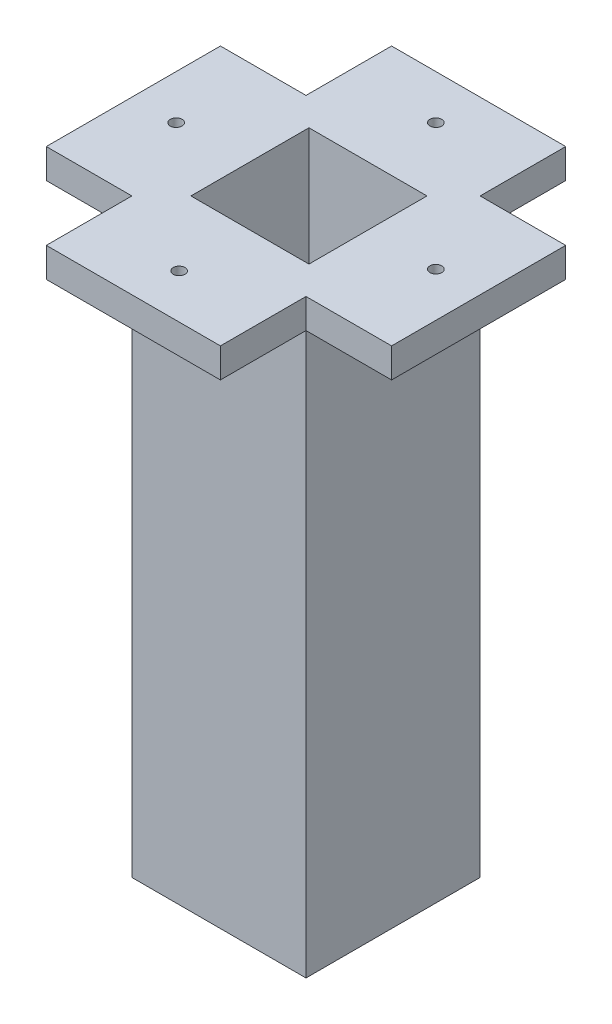
ISO-10303-21;
HEADER;
FILE_DESCRIPTION(('STEP AP214'),'2;1');
FILE_NAME('part.step','',(''),(''),'','','');
FILE_SCHEMA(('AUTOMOTIVE_DESIGN { 1 0 10303 214 1 1 1 1 }'));
ENDSEC;
DATA;
#1=APPLICATION_CONTEXT('core data for automotive mechanical design processes');
#2=APPLICATION_PROTOCOL_DEFINITION('international standard','automotive_design',2000,#1);
#3=PRODUCT_CONTEXT('',#1,'mechanical');
#4=PRODUCT('Part','Part','',(#3));
#5=PRODUCT_RELATED_PRODUCT_CATEGORY('part','',(#4));
#6=PRODUCT_DEFINITION_FORMATION('','',#4);
#7=PRODUCT_DEFINITION_CONTEXT('part definition',#1,'design');
#8=PRODUCT_DEFINITION('design','',#6,#7);
#9=PRODUCT_DEFINITION_SHAPE('','',#8);
#10=(LENGTH_UNIT() NAMED_UNIT(*) SI_UNIT(.MILLI.,.METRE.));
#11=(NAMED_UNIT(*) PLANE_ANGLE_UNIT() SI_UNIT($,.RADIAN.));
#12=(NAMED_UNIT(*) SI_UNIT($,.STERADIAN.) SOLID_ANGLE_UNIT());
#13=UNCERTAINTY_MEASURE_WITH_UNIT(LENGTH_MEASURE(1.E-05),#10,'distance_accuracy_value','');
#14=(GEOMETRIC_REPRESENTATION_CONTEXT(3) GLOBAL_UNCERTAINTY_ASSIGNED_CONTEXT((#13)) GLOBAL_UNIT_ASSIGNED_CONTEXT((#10,
#11,#12)) REPRESENTATION_CONTEXT('',''));
#15=CARTESIAN_POINT('',(0.,0.,0.));
#16=DIRECTION('',(0.,0.,1.));
#17=DIRECTION('',(1.,0.,0.));
#18=AXIS2_PLACEMENT_3D('',#15,#16,#17);
#19=CARTESIAN_POINT('',(0.,200.,-59.));
#20=DIRECTION('',(0.,0.,-1.));
#21=DIRECTION('',(-1.,0.,0.));
#22=AXIS2_PLACEMENT_3D('',#19,#20,#21);
#23=PLANE('',#22);
#24=DIRECTION('',(0.,1.,0.));
#25=VECTOR('',#24,1.);
#26=CARTESIAN_POINT('',(0.,190.,-59.));
#27=LINE('',#26,#25);
#28=CARTESIAN_POINT('',(0.,190.,-59.));
#29=VERTEX_POINT('',#28);
#30=CARTESIAN_POINT('',(0.,200.,-59.));
#31=VERTEX_POINT('',#30);
#32=EDGE_CURVE('E199',#29,#31,#27,.T.);
#33=ORIENTED_EDGE('',*,*,#32,.F.);
#34=DIRECTION('',(-1.,0.,0.));
#35=VECTOR('',#34,1.);
#36=CARTESIAN_POINT('',(0.,190.,-59.));
#37=LINE('',#36,#35);
#38=CARTESIAN_POINT('',(-29.,190.,-59.));
#39=VERTEX_POINT('',#38);
#40=EDGE_CURVE('E211',#29,#39,#37,.T.);
#41=ORIENTED_EDGE('',*,*,#40,.T.);
#42=DIRECTION('',(0.,1.,0.));
#43=VECTOR('',#42,1.);
#44=CARTESIAN_POINT('',(-29.,190.,-59.));
#45=LINE('',#44,#43);
#46=CARTESIAN_POINT('',(-29.,200.,-59.));
#47=VERTEX_POINT('',#46);
#48=EDGE_CURVE('E241',#39,#47,#45,.T.);
#49=ORIENTED_EDGE('',*,*,#48,.T.);
#50=DIRECTION('',(1.,0.,0.));
#51=VECTOR('',#50,1.);
#52=CARTESIAN_POINT('',(0.,200.,-59.));
#53=LINE('',#52,#51);
#54=EDGE_CURVE('E212',#47,#31,#53,.T.);
#55=ORIENTED_EDGE('',*,*,#54,.T.);
#56=EDGE_LOOP('',(#33,#41,#49,#55));
#57=FACE_BOUND('',#56,.T.);
#58=ADVANCED_FACE('F33',(#57),#23,.T.);
#59=DIRECTION('',(1.,0.,0.));
#60=VECTOR('',#59,1.);
#61=CARTESIAN_POINT('',(0.,190.,-59.));
#62=LINE('',#61,#60);
#63=CARTESIAN_POINT('',(59.,190.,-59.));
#64=VERTEX_POINT('',#63);
#65=CARTESIAN_POINT('',(88.,190.,-59.));
#66=VERTEX_POINT('',#65);
#67=EDGE_CURVE('E279',#64,#66,#62,.T.);
#68=ORIENTED_EDGE('',*,*,#67,.F.);
#69=DIRECTION('',(0.,1.,0.));
#70=VECTOR('',#69,1.);
#71=CARTESIAN_POINT('',(59.,190.,-59.));
#72=LINE('',#71,#70);
#73=CARTESIAN_POINT('',(59.,200.,-59.));
#74=VERTEX_POINT('',#73);
#75=EDGE_CURVE('E203',#64,#74,#72,.T.);
#76=ORIENTED_EDGE('',*,*,#75,.T.);
#77=CARTESIAN_POINT('',(88.,200.,-59.));
#78=VERTEX_POINT('',#77);
#79=EDGE_CURVE('E372',#74,#78,#53,.T.);
#80=ORIENTED_EDGE('',*,*,#79,.T.);
#81=DIRECTION('',(0.,1.,0.));
#82=VECTOR('',#81,1.);
#83=CARTESIAN_POINT('',(88.,190.,-59.));
#84=LINE('',#83,#82);
#85=EDGE_CURVE('E287',#66,#78,#84,.T.);
#86=ORIENTED_EDGE('',*,*,#85,.F.);
#87=EDGE_LOOP('',(#68,#76,#80,#86));
#88=FACE_BOUND('',#87,.T.);
#89=ADVANCED_FACE('F430',(#88),#23,.T.);
#90=CARTESIAN_POINT('',(0.,200.,0.));
#91=DIRECTION('',(-1.,0.,0.));
#92=DIRECTION('',(0.,0.,1.));
#93=AXIS2_PLACEMENT_3D('',#90,#91,#92);
#94=PLANE('',#93);
#95=DIRECTION('',(0.,1.,0.));
#96=VECTOR('',#95,1.);
#97=CARTESIAN_POINT('',(0.,190.,0.));
#98=LINE('',#97,#96);
#99=CARTESIAN_POINT('',(0.,190.,0.));
#100=VERTEX_POINT('',#99);
#101=CARTESIAN_POINT('',(0.,200.,0.));
#102=VERTEX_POINT('',#101);
#103=EDGE_CURVE('E577',#100,#102,#98,.T.);
#104=ORIENTED_EDGE('',*,*,#103,.F.);
#105=DIRECTION('',(0.,0.,1.));
#106=VECTOR('',#105,1.);
#107=CARTESIAN_POINT('',(0.,190.,0.));
#108=LINE('',#107,#106);
#109=CARTESIAN_POINT('',(0.,190.,29.));
#110=VERTEX_POINT('',#109);
#111=EDGE_CURVE('E259',#100,#110,#108,.T.);
#112=ORIENTED_EDGE('',*,*,#111,.T.);
#113=DIRECTION('',(0.,1.,0.));
#114=VECTOR('',#113,1.);
#115=CARTESIAN_POINT('',(0.,190.,29.));
#116=LINE('',#115,#114);
#117=CARTESIAN_POINT('',(0.,200.,29.));
#118=VERTEX_POINT('',#117);
#119=EDGE_CURVE('E256',#110,#118,#116,.T.);
#120=ORIENTED_EDGE('',*,*,#119,.T.);
#121=DIRECTION('',(0.,0.,-1.));
#122=VECTOR('',#121,1.);
#123=CARTESIAN_POINT('',(0.,200.,0.));
#124=LINE('',#123,#122);
#125=EDGE_CURVE('E56',#118,#102,#124,.T.);
#126=ORIENTED_EDGE('',*,*,#125,.T.);
#127=EDGE_LOOP('',(#104,#112,#120,#126));
#128=FACE_BOUND('',#127,.T.);
#129=ADVANCED_FACE('F434',(#128),#94,.T.);
#130=CARTESIAN_POINT('',(0.,200.,0.));
#131=DIRECTION('',(0.,0.,-1.));
#132=DIRECTION('',(-1.,0.,0.));
#133=AXIS2_PLACEMENT_3D('',#130,#131,#132);
#134=PLANE('',#133);
#135=DIRECTION('',(0.,1.,0.));
#136=VECTOR('',#135,1.);
#137=CARTESIAN_POINT('',(59.,190.,0.));
#138=LINE('',#137,#136);
#139=CARTESIAN_POINT('',(59.,190.,0.));
#140=VERTEX_POINT('',#139);
#141=CARTESIAN_POINT('',(59.,200.,0.));
#142=VERTEX_POINT('',#141);
#143=EDGE_CURVE('E251',#140,#142,#138,.T.);
#144=ORIENTED_EDGE('',*,*,#143,.F.);
#145=DIRECTION('',(1.,0.,0.));
#146=VECTOR('',#145,1.);
#147=CARTESIAN_POINT('',(0.,190.,0.));
#148=LINE('',#147,#146);
#149=CARTESIAN_POINT('',(88.,190.,0.));
#150=VERTEX_POINT('',#149);
#151=EDGE_CURVE('E284',#140,#150,#148,.T.);
#152=ORIENTED_EDGE('',*,*,#151,.T.);
#153=DIRECTION('',(0.,1.,0.));
#154=VECTOR('',#153,1.);
#155=CARTESIAN_POINT('',(88.,190.,0.));
#156=LINE('',#155,#154);
#157=CARTESIAN_POINT('',(88.,200.,0.));
#158=VERTEX_POINT('',#157);
#159=EDGE_CURVE('E290',#150,#158,#156,.T.);
#160=ORIENTED_EDGE('',*,*,#159,.T.);
#161=DIRECTION('',(1.,0.,0.));
#162=VECTOR('',#161,1.);
#163=CARTESIAN_POINT('',(0.,200.,0.));
#164=LINE('',#163,#162);
#165=EDGE_CURVE('E371',#142,#158,#164,.T.);
#166=ORIENTED_EDGE('',*,*,#165,.F.);
#167=EDGE_LOOP('',(#144,#152,#160,#166));
#168=FACE_BOUND('',#167,.T.);
#169=ADVANCED_FACE('F599',(#168),#134,.F.);
#170=DIRECTION('',(1.,0.,0.));
#171=VECTOR('',#170,1.);
#172=CARTESIAN_POINT('',(0.,190.,0.));
#173=LINE('',#172,#171);
#174=EDGE_CURVE('E266',#100,#140,#173,.T.);
#175=ORIENTED_EDGE('',*,*,#174,.F.);
#176=DIRECTION('',(0.,-1.,0.));
#177=VECTOR('',#176,1.);
#178=CARTESIAN_POINT('',(0.,200.,0.));
#179=LINE('',#178,#177);
#180=CARTESIAN_POINT('',(0.,0.,0.));
#181=VERTEX_POINT('',#180);
#182=EDGE_CURVE('E225',#100,#181,#179,.T.);
#183=ORIENTED_EDGE('',*,*,#182,.T.);
#184=DIRECTION('',(1.,0.,0.));
#185=VECTOR('',#184,1.);
#186=CARTESIAN_POINT('',(0.,0.,0.));
#187=LINE('',#186,#185);
#188=CARTESIAN_POINT('',(59.,0.,0.));
#189=VERTEX_POINT('',#188);
#190=EDGE_CURVE('E380',#181,#189,#187,.T.);
#191=ORIENTED_EDGE('',*,*,#190,.T.);
#192=DIRECTION('',(0.,-1.,0.));
#193=VECTOR('',#192,1.);
#194=CARTESIAN_POINT('',(59.,200.,0.));
#195=LINE('',#194,#193);
#196=EDGE_CURVE('E386',#140,#189,#195,.T.);
#197=ORIENTED_EDGE('',*,*,#196,.F.);
#198=EDGE_LOOP('',(#175,#183,#191,#197));
#199=FACE_BOUND('',#198,.T.);
#200=ADVANCED_FACE('F610',(#199),#134,.F.);
#201=CARTESIAN_POINT('',(59.,200.,0.));
#202=DIRECTION('',(-1.,0.,0.));
#203=DIRECTION('',(0.,0.,1.));
#204=AXIS2_PLACEMENT_3D('',#201,#202,#203);
#205=PLANE('',#204);
#206=DIRECTION('',(0.,0.,-1.));
#207=VECTOR('',#206,1.);
#208=CARTESIAN_POINT('',(59.,190.,0.));
#209=LINE('',#208,#207);
#210=EDGE_CURVE('E281',#140,#64,#209,.T.);
#211=ORIENTED_EDGE('',*,*,#210,.F.);
#212=ORIENTED_EDGE('',*,*,#196,.T.);
#213=DIRECTION('',(0.,0.,-1.));
#214=VECTOR('',#213,1.);
#215=CARTESIAN_POINT('',(59.,0.,0.));
#216=LINE('',#215,#214);
#217=CARTESIAN_POINT('',(59.,0.,-59.));
#218=VERTEX_POINT('',#217);
#219=EDGE_CURVE('E377',#189,#218,#216,.T.);
#220=ORIENTED_EDGE('',*,*,#219,.T.);
#221=DIRECTION('',(0.,-1.,0.));
#222=VECTOR('',#221,1.);
#223=CARTESIAN_POINT('',(59.,200.,-59.));
#224=LINE('',#223,#222);
#225=EDGE_CURVE('E375',#64,#218,#224,.T.);
#226=ORIENTED_EDGE('',*,*,#225,.F.);
#227=EDGE_LOOP('',(#211,#212,#220,#226));
#228=FACE_BOUND('',#227,.T.);
#229=ADVANCED_FACE('F449',(#228),#205,.F.);
#230=DIRECTION('',(0.,0.,1.));
#231=VECTOR('',#230,1.);
#232=CARTESIAN_POINT('',(0.,190.,0.));
#233=LINE('',#232,#231);
#234=EDGE_CURVE('E219',#29,#100,#233,.T.);
#235=ORIENTED_EDGE('',*,*,#234,.F.);
#236=DIRECTION('',(0.,-1.,0.));
#237=VECTOR('',#236,1.);
#238=CARTESIAN_POINT('',(0.,200.,-59.));
#239=LINE('',#238,#237);
#240=CARTESIAN_POINT('',(0.,0.,-59.));
#241=VERTEX_POINT('',#240);
#242=EDGE_CURVE('E223',#29,#241,#239,.T.);
#243=ORIENTED_EDGE('',*,*,#242,.T.);
#244=DIRECTION('',(0.,0.,-1.));
#245=VECTOR('',#244,1.);
#246=CARTESIAN_POINT('',(0.,0.,0.));
#247=LINE('',#246,#245);
#248=EDGE_CURVE('E383',#181,#241,#247,.T.);
#249=ORIENTED_EDGE('',*,*,#248,.F.);
#250=ORIENTED_EDGE('',*,*,#182,.F.);
#251=EDGE_LOOP('',(#235,#243,#249,#250));
#252=FACE_BOUND('',#251,.T.);
#253=CARTESIAN_POINT('',(0.,123.5,-25.5));
#254=DIRECTION('',(-1.,0.,0.));
#255=DIRECTION('',(0.,0.,1.));
#256=AXIS2_PLACEMENT_3D('',#253,#254,#255);
#257=CIRCLE('',#256,2.00000000000001);
#258=CARTESIAN_POINT('',(0.,123.5,-23.5));
#259=VERTEX_POINT('',#258);
#260=EDGE_CURVE('E306',#259,#259,#257,.T.);
#261=ORIENTED_EDGE('',*,*,#260,.F.);
#262=EDGE_LOOP('',(#261));
#263=FACE_BOUND('',#262,.T.);
#264=CARTESIAN_POINT('',(0.,75.5,-33.5));
#265=DIRECTION('',(-1.,0.,0.));
#266=DIRECTION('',(0.,0.,1.));
#267=AXIS2_PLACEMENT_3D('',#264,#265,#266);
#268=CIRCLE('',#267,2.);
#269=CARTESIAN_POINT('',(0.,75.5,-31.5));
#270=VERTEX_POINT('',#269);
#271=EDGE_CURVE('E299',#270,#270,#268,.T.);
#272=ORIENTED_EDGE('',*,*,#271,.F.);
#273=EDGE_LOOP('',(#272));
#274=FACE_BOUND('',#273,.T.);
#275=CARTESIAN_POINT('',(0.,75.5,-25.5));
#276=DIRECTION('',(-1.,0.,0.));
#277=DIRECTION('',(0.,0.,1.));
#278=AXIS2_PLACEMENT_3D('',#275,#276,#277);
#279=CIRCLE('',#278,1.99999999999999);
#280=CARTESIAN_POINT('',(0.,75.5,-23.5));
#281=VERTEX_POINT('',#280);
#282=EDGE_CURVE('E293',#281,#281,#279,.T.);
#283=ORIENTED_EDGE('',*,*,#282,.F.);
#284=EDGE_LOOP('',(#283));
#285=FACE_BOUND('',#284,.T.);
#286=CARTESIAN_POINT('',(0.,123.5,-33.5));
#287=DIRECTION('',(-1.,0.,0.));
#288=DIRECTION('',(0.,0.,1.));
#289=AXIS2_PLACEMENT_3D('',#286,#287,#288);
#290=CIRCLE('',#289,2.);
#291=CARTESIAN_POINT('',(0.,123.5,-31.5));
#292=VERTEX_POINT('',#291);
#293=EDGE_CURVE('E305',#292,#292,#290,.T.);
#294=ORIENTED_EDGE('',*,*,#293,.F.);
#295=EDGE_LOOP('',(#294));
#296=FACE_BOUND('',#295,.T.);
#297=DIRECTION('',(0.,0.,-1.));
#298=VECTOR('',#297,1.);
#299=CARTESIAN_POINT('',(0.,79.,-39.));
#300=LINE('',#299,#298);
#301=CARTESIAN_POINT('',(0.,79.,-20.));
#302=VERTEX_POINT('',#301);
#303=CARTESIAN_POINT('',(0.,79.,-39.));
#304=VERTEX_POINT('',#303);
#305=EDGE_CURVE('E323',#302,#304,#300,.T.);
#306=ORIENTED_EDGE('',*,*,#305,.T.);
#307=DIRECTION('',(0.,1.,0.));
#308=VECTOR('',#307,1.);
#309=CARTESIAN_POINT('',(0.,120.,-39.));
#310=LINE('',#309,#308);
#311=CARTESIAN_POINT('',(0.,120.,-39.));
#312=VERTEX_POINT('',#311);
#313=EDGE_CURVE('E317',#304,#312,#310,.T.);
#314=ORIENTED_EDGE('',*,*,#313,.T.);
#315=DIRECTION('',(0.,0.,1.));
#316=VECTOR('',#315,1.);
#317=CARTESIAN_POINT('',(0.,120.,-39.));
#318=LINE('',#317,#316);
#319=CARTESIAN_POINT('',(0.,120.,-20.));
#320=VERTEX_POINT('',#319);
#321=EDGE_CURVE('E333',#312,#320,#318,.T.);
#322=ORIENTED_EDGE('',*,*,#321,.T.);
#323=DIRECTION('',(0.,-1.,0.));
#324=VECTOR('',#323,1.);
#325=CARTESIAN_POINT('',(0.,120.,-20.));
#326=LINE('',#325,#324);
#327=EDGE_CURVE('E336',#320,#302,#326,.T.);
#328=ORIENTED_EDGE('',*,*,#327,.T.);
#329=EDGE_LOOP('',(#306,#314,#322,#328));
#330=FACE_BOUND('',#329,.T.);
#331=ADVANCED_FACE('F220',(#252,#263,#274,#285,#296,#330),#94,.T.);
#332=CARTESIAN_POINT('',(9.99999999999999,-50.,-50.));
#333=DIRECTION('',(-1.,0.,0.));
#334=DIRECTION('',(0.,0.,1.));
#335=AXIS2_PLACEMENT_3D('',#332,#333,#334);
#336=PLANE('',#335);
#337=CARTESIAN_POINT('',(10.,123.5,-25.5));
#338=DIRECTION('',(-1.,0.,0.));
#339=DIRECTION('',(0.,0.,1.));
#340=AXIS2_PLACEMENT_3D('',#337,#338,#339);
#341=CIRCLE('',#340,2.00000000000001);
#342=CARTESIAN_POINT('',(10.,123.5,-23.5));
#343=VERTEX_POINT('',#342);
#344=EDGE_CURVE('E302',#343,#343,#341,.T.);
#345=ORIENTED_EDGE('',*,*,#344,.T.);
#346=EDGE_LOOP('',(#345));
#347=FACE_BOUND('',#346,.T.);
#348=CARTESIAN_POINT('',(10.,75.5,-33.5));
#349=DIRECTION('',(-1.,0.,0.));
#350=DIRECTION('',(0.,0.,1.));
#351=AXIS2_PLACEMENT_3D('',#348,#349,#350);
#352=CIRCLE('',#351,2.);
#353=CARTESIAN_POINT('',(10.,75.5,-31.5));
#354=VERTEX_POINT('',#353);
#355=EDGE_CURVE('E309',#354,#354,#352,.T.);
#356=ORIENTED_EDGE('',*,*,#355,.T.);
#357=EDGE_LOOP('',(#356));
#358=FACE_BOUND('',#357,.T.);
#359=CARTESIAN_POINT('',(10.,75.5,-25.5));
#360=DIRECTION('',(-1.,0.,0.));
#361=DIRECTION('',(0.,0.,1.));
#362=AXIS2_PLACEMENT_3D('',#359,#360,#361);
#363=CIRCLE('',#362,1.99999999999999);
#364=CARTESIAN_POINT('',(10.,75.5,-23.5));
#365=VERTEX_POINT('',#364);
#366=EDGE_CURVE('E296',#365,#365,#363,.T.);
#367=ORIENTED_EDGE('',*,*,#366,.T.);
#368=EDGE_LOOP('',(#367));
#369=FACE_BOUND('',#368,.T.);
#370=CARTESIAN_POINT('',(10.,123.5,-33.5));
#371=DIRECTION('',(-1.,0.,0.));
#372=DIRECTION('',(0.,0.,1.));
#373=AXIS2_PLACEMENT_3D('',#370,#371,#372);
#374=CIRCLE('',#373,2.);
#375=CARTESIAN_POINT('',(10.,123.5,-31.5));
#376=VERTEX_POINT('',#375);
#377=EDGE_CURVE('E314',#376,#376,#374,.T.);
#378=ORIENTED_EDGE('',*,*,#377,.T.);
#379=EDGE_LOOP('',(#378));
#380=FACE_BOUND('',#379,.T.);
#381=DIRECTION('',(0.,1.,0.));
#382=VECTOR('',#381,1.);
#383=CARTESIAN_POINT('',(9.99999999999999,-50.,-50.));
#384=LINE('',#383,#382);
#385=CARTESIAN_POINT('',(9.99999999999999,0.,-50.));
#386=VERTEX_POINT('',#385);
#387=CARTESIAN_POINT('',(9.99999999999999,200.,-50.));
#388=VERTEX_POINT('',#387);
#389=EDGE_CURVE('E364',#386,#388,#384,.T.);
#390=ORIENTED_EDGE('',*,*,#389,.T.);
#391=DIRECTION('',(0.,0.,1.));
#392=VECTOR('',#391,1.);
#393=CARTESIAN_POINT('',(9.99999999999999,200.,-50.));
#394=LINE('',#393,#392);
#395=CARTESIAN_POINT('',(10.,200.,-10.));
#396=VERTEX_POINT('',#395);
#397=EDGE_CURVE('E358',#388,#396,#394,.T.);
#398=ORIENTED_EDGE('',*,*,#397,.T.);
#399=DIRECTION('',(0.,1.,0.));
#400=VECTOR('',#399,1.);
#401=CARTESIAN_POINT('',(10.,-50.,-10.));
#402=LINE('',#401,#400);
#403=CARTESIAN_POINT('',(10.,0.,-10.));
#404=VERTEX_POINT('',#403);
#405=EDGE_CURVE('E362',#404,#396,#402,.T.);
#406=ORIENTED_EDGE('',*,*,#405,.F.);
#407=DIRECTION('',(0.,0.,1.));
#408=VECTOR('',#407,1.);
#409=CARTESIAN_POINT('',(10.,0.,0.));
#410=LINE('',#409,#408);
#411=EDGE_CURVE('E41',#386,#404,#410,.T.);
#412=ORIENTED_EDGE('',*,*,#411,.F.);
#413=EDGE_LOOP('',(#390,#398,#406,#412));
#414=FACE_BOUND('',#413,.T.);
#415=DIRECTION('',(0.,1.,0.));
#416=VECTOR('',#415,1.);
#417=CARTESIAN_POINT('',(10.,120.,-39.));
#418=LINE('',#417,#416);
#419=CARTESIAN_POINT('',(10.,79.,-39.));
#420=VERTEX_POINT('',#419);
#421=CARTESIAN_POINT('',(10.,120.,-39.));
#422=VERTEX_POINT('',#421);
#423=EDGE_CURVE('E320',#420,#422,#418,.T.);
#424=ORIENTED_EDGE('',*,*,#423,.F.);
#425=DIRECTION('',(0.,0.,-1.));
#426=VECTOR('',#425,1.);
#427=CARTESIAN_POINT('',(10.,79.,-39.));
#428=LINE('',#427,#426);
#429=CARTESIAN_POINT('',(10.,79.,-20.));
#430=VERTEX_POINT('',#429);
#431=EDGE_CURVE('E328',#430,#420,#428,.T.);
#432=ORIENTED_EDGE('',*,*,#431,.F.);
#433=DIRECTION('',(0.,-1.,0.));
#434=VECTOR('',#433,1.);
#435=CARTESIAN_POINT('',(10.,120.,-20.));
#436=LINE('',#435,#434);
#437=CARTESIAN_POINT('',(10.,120.,-20.));
#438=VERTEX_POINT('',#437);
#439=EDGE_CURVE('E325',#438,#430,#436,.T.);
#440=ORIENTED_EDGE('',*,*,#439,.F.);
#441=DIRECTION('',(0.,0.,1.));
#442=VECTOR('',#441,1.);
#443=CARTESIAN_POINT('',(10.,120.,-39.));
#444=LINE('',#443,#442);
#445=EDGE_CURVE('E322',#422,#438,#444,.T.);
#446=ORIENTED_EDGE('',*,*,#445,.F.);
#447=EDGE_LOOP('',(#424,#432,#440,#446));
#448=FACE_BOUND('',#447,.T.);
#449=ADVANCED_FACE('F401',(#347,#358,#369,#380,#414,#448),#336,.F.);
#450=DIRECTION('',(-1.,0.,0.));
#451=VECTOR('',#450,1.);
#452=CARTESIAN_POINT('',(0.,190.,-59.));
#453=LINE('',#452,#451);
#454=EDGE_CURVE('E183',#64,#29,#453,.T.);
#455=ORIENTED_EDGE('',*,*,#454,.F.);
#456=ORIENTED_EDGE('',*,*,#225,.T.);
#457=DIRECTION('',(1.,0.,0.));
#458=VECTOR('',#457,1.);
#459=CARTESIAN_POINT('',(0.,0.,-59.));
#460=LINE('',#459,#458);
#461=EDGE_CURVE('E233',#241,#218,#460,.T.);
#462=ORIENTED_EDGE('',*,*,#461,.F.);
#463=ORIENTED_EDGE('',*,*,#242,.F.);
#464=EDGE_LOOP('',(#455,#456,#462,#463));
#465=FACE_BOUND('',#464,.T.);
#466=ADVANCED_FACE('F35',(#465),#23,.T.);
#467=CARTESIAN_POINT('',(0.,200.,0.));
#468=DIRECTION('',(0.,1.,0.));
#469=DIRECTION('',(0.,0.,1.));
#470=AXIS2_PLACEMENT_3D('',#467,#468,#469);
#471=PLANE('',#470);
#472=CARTESIAN_POINT('',(73.,200.,-30.));
#473=DIRECTION('',(0.,-1.,0.));
#474=DIRECTION('',(0.,0.,-1.));
#475=AXIS2_PLACEMENT_3D('',#472,#473,#474);
#476=CIRCLE('',#475,2.);
#477=CARTESIAN_POINT('',(73.,200.,-32.));
#478=VERTEX_POINT('',#477);
#479=EDGE_CURVE('E543',#478,#478,#476,.T.);
#480=ORIENTED_EDGE('',*,*,#479,.T.);
#481=EDGE_LOOP('',(#480));
#482=FACE_BOUND('',#481,.T.);
#483=CARTESIAN_POINT('',(30.,200.,14.));
#484=DIRECTION('',(0.,-1.,0.));
#485=DIRECTION('',(0.,0.,-1.));
#486=AXIS2_PLACEMENT_3D('',#483,#484,#485);
#487=CIRCLE('',#486,2.);
#488=CARTESIAN_POINT('',(30.,200.,12.));
#489=VERTEX_POINT('',#488);
#490=EDGE_CURVE('E547',#489,#489,#487,.T.);
#491=ORIENTED_EDGE('',*,*,#490,.T.);
#492=EDGE_LOOP('',(#491));
#493=FACE_BOUND('',#492,.T.);
#494=CARTESIAN_POINT('',(-14.,200.,-29.));
#495=DIRECTION('',(0.,-1.,0.));
#496=DIRECTION('',(0.,0.,-1.));
#497=AXIS2_PLACEMENT_3D('',#494,#495,#496);
#498=CIRCLE('',#497,2.);
#499=CARTESIAN_POINT('',(-14.,200.,-31.));
#500=VERTEX_POINT('',#499);
#501=EDGE_CURVE('E556',#500,#500,#498,.T.);
#502=ORIENTED_EDGE('',*,*,#501,.T.);
#503=EDGE_LOOP('',(#502));
#504=FACE_BOUND('',#503,.T.);
#505=CARTESIAN_POINT('',(30.,200.,-73.));
#506=DIRECTION('',(0.,-1.,0.));
#507=DIRECTION('',(0.,0.,-1.));
#508=AXIS2_PLACEMENT_3D('',#505,#506,#507);
#509=CIRCLE('',#508,2.);
#510=CARTESIAN_POINT('',(30.,200.,-75.));
#511=VERTEX_POINT('',#510);
#512=EDGE_CURVE('E562',#511,#511,#509,.T.);
#513=ORIENTED_EDGE('',*,*,#512,.T.);
#514=EDGE_LOOP('',(#513));
#515=FACE_BOUND('',#514,.T.);
#516=DIRECTION('',(1.,0.,0.));
#517=VECTOR('',#516,1.);
#518=CARTESIAN_POINT('',(10.,200.,-10.));
#519=LINE('',#518,#517);
#520=CARTESIAN_POINT('',(50.,200.,-10.));
#521=VERTEX_POINT('',#520);
#522=EDGE_CURVE('E350',#396,#521,#519,.T.);
#523=ORIENTED_EDGE('',*,*,#522,.F.);
#524=ORIENTED_EDGE('',*,*,#397,.F.);
#525=DIRECTION('',(1.,0.,0.));
#526=VECTOR('',#525,1.);
#527=CARTESIAN_POINT('',(9.99999999999999,200.,-50.));
#528=LINE('',#527,#526);
#529=CARTESIAN_POINT('',(50.,200.,-50.));
#530=VERTEX_POINT('',#529);
#531=EDGE_CURVE('E355',#388,#530,#528,.T.);
#532=ORIENTED_EDGE('',*,*,#531,.T.);
#533=DIRECTION('',(0.,0.,1.));
#534=VECTOR('',#533,1.);
#535=CARTESIAN_POINT('',(50.,200.,-50.));
#536=LINE('',#535,#534);
#537=EDGE_CURVE('E352',#530,#521,#536,.T.);
#538=ORIENTED_EDGE('',*,*,#537,.T.);
#539=EDGE_LOOP('',(#523,#524,#532,#538));
#540=FACE_BOUND('',#539,.T.);
#541=ORIENTED_EDGE('',*,*,#54,.F.);
#542=DIRECTION('',(0.,0.,1.));
#543=VECTOR('',#542,1.);
#544=CARTESIAN_POINT('',(-29.,200.,0.));
#545=LINE('',#544,#543);
#546=CARTESIAN_POINT('',(-29.,200.,0.));
#547=VERTEX_POINT('',#546);
#548=EDGE_CURVE('E269',#47,#547,#545,.T.);
#549=ORIENTED_EDGE('',*,*,#548,.T.);
#550=DIRECTION('',(-1.,0.,0.));
#551=VECTOR('',#550,1.);
#552=CARTESIAN_POINT('',(0.,200.,0.));
#553=LINE('',#552,#551);
#554=EDGE_CURVE('E244',#102,#547,#553,.T.);
#555=ORIENTED_EDGE('',*,*,#554,.F.);
#556=ORIENTED_EDGE('',*,*,#125,.F.);
#557=DIRECTION('',(1.,0.,0.));
#558=VECTOR('',#557,1.);
#559=CARTESIAN_POINT('',(0.,200.,29.));
#560=LINE('',#559,#558);
#561=CARTESIAN_POINT('',(59.,200.,29.));
#562=VERTEX_POINT('',#561);
#563=EDGE_CURVE('E262',#118,#562,#560,.T.);
#564=ORIENTED_EDGE('',*,*,#563,.T.);
#565=DIRECTION('',(0.,0.,1.));
#566=VECTOR('',#565,1.);
#567=CARTESIAN_POINT('',(59.,200.,0.));
#568=LINE('',#567,#566);
#569=EDGE_CURVE('E255',#142,#562,#568,.T.);
#570=ORIENTED_EDGE('',*,*,#569,.F.);
#571=ORIENTED_EDGE('',*,*,#165,.T.);
#572=DIRECTION('',(0.,0.,1.));
#573=VECTOR('',#572,1.);
#574=CARTESIAN_POINT('',(88.,200.,0.));
#575=LINE('',#574,#573);
#576=EDGE_CURVE('E265',#78,#158,#575,.T.);
#577=ORIENTED_EDGE('',*,*,#576,.F.);
#578=ORIENTED_EDGE('',*,*,#79,.F.);
#579=DIRECTION('',(0.,0.,-1.));
#580=VECTOR('',#579,1.);
#581=CARTESIAN_POINT('',(59.,200.,0.));
#582=LINE('',#581,#580);
#583=CARTESIAN_POINT('',(59.,200.,-88.));
#584=VERTEX_POINT('',#583);
#585=EDGE_CURVE('E48',#74,#584,#582,.T.);
#586=ORIENTED_EDGE('',*,*,#585,.T.);
#587=DIRECTION('',(-1.,0.,0.));
#588=VECTOR('',#587,1.);
#589=CARTESIAN_POINT('',(0.,200.,-88.));
#590=LINE('',#589,#588);
#591=CARTESIAN_POINT('',(0.,200.,-88.));
#592=VERTEX_POINT('',#591);
#593=EDGE_CURVE('E242',#584,#592,#590,.T.);
#594=ORIENTED_EDGE('',*,*,#593,.T.);
#595=DIRECTION('',(0.,0.,-1.));
#596=VECTOR('',#595,1.);
#597=CARTESIAN_POINT('',(0.,200.,0.));
#598=LINE('',#597,#596);
#599=EDGE_CURVE('E214',#31,#592,#598,.T.);
#600=ORIENTED_EDGE('',*,*,#599,.F.);
#601=EDGE_LOOP('',(#541,#549,#555,#556,#564,#570,#571,#577,#578,#586,#594,#600));
#602=FACE_BOUND('',#601,.T.);
#603=ADVANCED_FACE('F410',(#482,#493,#504,#515,#540,#602),#471,.T.);
#604=CARTESIAN_POINT('',(0.,0.,0.));
#605=DIRECTION('',(0.,1.,0.));
#606=DIRECTION('',(0.,0.,1.));
#607=AXIS2_PLACEMENT_3D('',#604,#605,#606);
#608=PLANE('',#607);
#609=ORIENTED_EDGE('',*,*,#411,.T.);
#610=DIRECTION('',(1.,0.,0.));
#611=VECTOR('',#610,1.);
#612=CARTESIAN_POINT('',(0.,0.,-10.));
#613=LINE('',#612,#611);
#614=CARTESIAN_POINT('',(50.,0.,-10.));
#615=VERTEX_POINT('',#614);
#616=EDGE_CURVE('E11',#404,#615,#613,.T.);
#617=ORIENTED_EDGE('',*,*,#616,.T.);
#618=DIRECTION('',(0.,0.,1.));
#619=VECTOR('',#618,1.);
#620=CARTESIAN_POINT('',(50.,0.,0.));
#621=LINE('',#620,#619);
#622=CARTESIAN_POINT('',(50.,0.,-50.));
#623=VERTEX_POINT('',#622);
#624=EDGE_CURVE('E235',#623,#615,#621,.T.);
#625=ORIENTED_EDGE('',*,*,#624,.F.);
#626=DIRECTION('',(1.,0.,0.));
#627=VECTOR('',#626,1.);
#628=CARTESIAN_POINT('',(0.,0.,-50.));
#629=LINE('',#628,#627);
#630=EDGE_CURVE('E390',#386,#623,#629,.T.);
#631=ORIENTED_EDGE('',*,*,#630,.F.);
#632=EDGE_LOOP('',(#609,#617,#625,#631));
#633=FACE_BOUND('',#632,.T.);
#634=ORIENTED_EDGE('',*,*,#461,.T.);
#635=ORIENTED_EDGE('',*,*,#219,.F.);
#636=ORIENTED_EDGE('',*,*,#190,.F.);
#637=ORIENTED_EDGE('',*,*,#248,.T.);
#638=EDGE_LOOP('',(#634,#635,#636,#637));
#639=FACE_BOUND('',#638,.T.);
#640=ADVANCED_FACE('F395',(#633,#639),#608,.F.);
#641=CARTESIAN_POINT('',(10.,-50.,-10.));
#642=DIRECTION('',(0.,0.,1.));
#643=DIRECTION('',(1.,0.,0.));
#644=AXIS2_PLACEMENT_3D('',#641,#642,#643);
#645=PLANE('',#644);
#646=ORIENTED_EDGE('',*,*,#405,.T.);
#647=ORIENTED_EDGE('',*,*,#522,.T.);
#648=DIRECTION('',(0.,1.,0.));
#649=VECTOR('',#648,1.);
#650=CARTESIAN_POINT('',(50.,-50.,-10.));
#651=LINE('',#650,#649);
#652=EDGE_CURVE('E361',#615,#521,#651,.T.);
#653=ORIENTED_EDGE('',*,*,#652,.F.);
#654=ORIENTED_EDGE('',*,*,#616,.F.);
#655=EDGE_LOOP('',(#646,#647,#653,#654));
#656=FACE_BOUND('',#655,.T.);
#657=ADVANCED_FACE('F414',(#656),#645,.F.);
#658=CARTESIAN_POINT('',(9.99999999999999,-50.,-50.));
#659=DIRECTION('',(0.,0.,1.));
#660=DIRECTION('',(1.,0.,0.));
#661=AXIS2_PLACEMENT_3D('',#658,#659,#660);
#662=PLANE('',#661);
#663=ORIENTED_EDGE('',*,*,#630,.T.);
#664=DIRECTION('',(0.,1.,0.));
#665=VECTOR('',#664,1.);
#666=CARTESIAN_POINT('',(50.,-50.,-50.));
#667=LINE('',#666,#665);
#668=EDGE_CURVE('E366',#623,#530,#667,.T.);
#669=ORIENTED_EDGE('',*,*,#668,.T.);
#670=ORIENTED_EDGE('',*,*,#531,.F.);
#671=ORIENTED_EDGE('',*,*,#389,.F.);
#672=EDGE_LOOP('',(#663,#669,#670,#671));
#673=FACE_BOUND('',#672,.T.);
#674=ADVANCED_FACE('F405',(#673),#662,.T.);
#675=CARTESIAN_POINT('',(50.,-50.,-50.));
#676=DIRECTION('',(-1.,0.,0.));
#677=DIRECTION('',(0.,0.,1.));
#678=AXIS2_PLACEMENT_3D('',#675,#676,#677);
#679=PLANE('',#678);
#680=ORIENTED_EDGE('',*,*,#624,.T.);
#681=ORIENTED_EDGE('',*,*,#652,.T.);
#682=ORIENTED_EDGE('',*,*,#537,.F.);
#683=ORIENTED_EDGE('',*,*,#668,.F.);
#684=EDGE_LOOP('',(#680,#681,#682,#683));
#685=FACE_BOUND('',#684,.T.);
#686=ADVANCED_FACE('F416',(#685),#679,.T.);
#687=CARTESIAN_POINT('',(10.,120.,-39.));
#688=DIRECTION('',(0.,0.,1.));
#689=DIRECTION('',(0.,-1.,0.));
#690=AXIS2_PLACEMENT_3D('',#687,#688,#689);
#691=PLANE('',#690);
#692=ORIENTED_EDGE('',*,*,#313,.F.);
#693=DIRECTION('',(-1.,0.,0.));
#694=VECTOR('',#693,1.);
#695=CARTESIAN_POINT('',(10.,79.,-39.));
#696=LINE('',#695,#694);
#697=EDGE_CURVE('E330',#420,#304,#696,.T.);
#698=ORIENTED_EDGE('',*,*,#697,.F.);
#699=ORIENTED_EDGE('',*,*,#423,.T.);
#700=DIRECTION('',(-1.,0.,0.));
#701=VECTOR('',#700,1.);
#702=CARTESIAN_POINT('',(10.,120.,-39.));
#703=LINE('',#702,#701);
#704=EDGE_CURVE('E347',#422,#312,#703,.T.);
#705=ORIENTED_EDGE('',*,*,#704,.T.);
#706=EDGE_LOOP('',(#692,#698,#699,#705));
#707=FACE_BOUND('',#706,.T.);
#708=ADVANCED_FACE('F418',(#707),#691,.T.);
#709=CARTESIAN_POINT('',(10.,120.,-39.));
#710=DIRECTION('',(0.,-1.,0.));
#711=DIRECTION('',(0.,0.,-1.));
#712=AXIS2_PLACEMENT_3D('',#709,#710,#711);
#713=PLANE('',#712);
#714=ORIENTED_EDGE('',*,*,#321,.F.);
#715=ORIENTED_EDGE('',*,*,#704,.F.);
#716=ORIENTED_EDGE('',*,*,#445,.T.);
#717=DIRECTION('',(-1.,0.,0.));
#718=VECTOR('',#717,1.);
#719=CARTESIAN_POINT('',(10.,120.,-20.));
#720=LINE('',#719,#718);
#721=EDGE_CURVE('E345',#438,#320,#720,.T.);
#722=ORIENTED_EDGE('',*,*,#721,.T.);
#723=EDGE_LOOP('',(#714,#715,#716,#722));
#724=FACE_BOUND('',#723,.T.);
#725=ADVANCED_FACE('F424',(#724),#713,.T.);
#726=CARTESIAN_POINT('',(10.,120.,-20.));
#727=DIRECTION('',(0.,0.,-1.));
#728=DIRECTION('',(0.,1.,0.));
#729=AXIS2_PLACEMENT_3D('',#726,#727,#728);
#730=PLANE('',#729);
#731=ORIENTED_EDGE('',*,*,#327,.F.);
#732=ORIENTED_EDGE('',*,*,#721,.F.);
#733=ORIENTED_EDGE('',*,*,#439,.T.);
#734=DIRECTION('',(-1.,0.,0.));
#735=VECTOR('',#734,1.);
#736=CARTESIAN_POINT('',(10.,79.,-20.));
#737=LINE('',#736,#735);
#738=EDGE_CURVE('E343',#430,#302,#737,.T.);
#739=ORIENTED_EDGE('',*,*,#738,.T.);
#740=EDGE_LOOP('',(#731,#732,#733,#739));
#741=FACE_BOUND('',#740,.T.);
#742=ADVANCED_FACE('F455',(#741),#730,.T.);
#743=CARTESIAN_POINT('',(10.,79.,-39.));
#744=DIRECTION('',(0.,1.,0.));
#745=DIRECTION('',(0.,0.,1.));
#746=AXIS2_PLACEMENT_3D('',#743,#744,#745);
#747=PLANE('',#746);
#748=ORIENTED_EDGE('',*,*,#305,.F.);
#749=ORIENTED_EDGE('',*,*,#738,.F.);
#750=ORIENTED_EDGE('',*,*,#431,.T.);
#751=ORIENTED_EDGE('',*,*,#697,.T.);
#752=EDGE_LOOP('',(#748,#749,#750,#751));
#753=FACE_BOUND('',#752,.T.);
#754=ADVANCED_FACE('F459',(#753),#747,.T.);
#755=CARTESIAN_POINT('',(10.,123.5,-33.5));
#756=DIRECTION('',(-1.,0.,0.));
#757=DIRECTION('',(0.,0.,1.));
#758=AXIS2_PLACEMENT_3D('',#755,#756,#757);
#759=CYLINDRICAL_SURFACE('',#758,2.);
#760=ORIENTED_EDGE('',*,*,#377,.F.);
#761=EDGE_LOOP('',(#760));
#762=FACE_BOUND('',#761,.T.);
#763=ORIENTED_EDGE('',*,*,#293,.T.);
#764=EDGE_LOOP('',(#763));
#765=FACE_BOUND('',#764,.T.);
#766=ADVANCED_FACE('F463',(#762,#765),#759,.F.);
#767=CARTESIAN_POINT('',(10.,75.5,-25.5));
#768=DIRECTION('',(-1.,0.,0.));
#769=DIRECTION('',(0.,0.,1.));
#770=AXIS2_PLACEMENT_3D('',#767,#768,#769);
#771=CYLINDRICAL_SURFACE('',#770,1.99999999999999);
#772=ORIENTED_EDGE('',*,*,#366,.F.);
#773=EDGE_LOOP('',(#772));
#774=FACE_BOUND('',#773,.T.);
#775=ORIENTED_EDGE('',*,*,#282,.T.);
#776=EDGE_LOOP('',(#775));
#777=FACE_BOUND('',#776,.T.);
#778=ADVANCED_FACE('F467',(#774,#777),#771,.F.);
#779=CARTESIAN_POINT('',(10.,75.5,-33.5));
#780=DIRECTION('',(-1.,0.,0.));
#781=DIRECTION('',(0.,0.,1.));
#782=AXIS2_PLACEMENT_3D('',#779,#780,#781);
#783=CYLINDRICAL_SURFACE('',#782,2.);
#784=ORIENTED_EDGE('',*,*,#355,.F.);
#785=EDGE_LOOP('',(#784));
#786=FACE_BOUND('',#785,.T.);
#787=ORIENTED_EDGE('',*,*,#271,.T.);
#788=EDGE_LOOP('',(#787));
#789=FACE_BOUND('',#788,.T.);
#790=ADVANCED_FACE('F469',(#786,#789),#783,.F.);
#791=CARTESIAN_POINT('',(10.,123.5,-25.5));
#792=DIRECTION('',(-1.,0.,0.));
#793=DIRECTION('',(0.,0.,1.));
#794=AXIS2_PLACEMENT_3D('',#791,#792,#793);
#795=CYLINDRICAL_SURFACE('',#794,2.00000000000001);
#796=ORIENTED_EDGE('',*,*,#344,.F.);
#797=EDGE_LOOP('',(#796));
#798=FACE_BOUND('',#797,.T.);
#799=ORIENTED_EDGE('',*,*,#260,.T.);
#800=EDGE_LOOP('',(#799));
#801=FACE_BOUND('',#800,.T.);
#802=ADVANCED_FACE('F472',(#798,#801),#795,.F.);
#803=CARTESIAN_POINT('',(88.,190.,0.));
#804=DIRECTION('',(-1.,0.,0.));
#805=DIRECTION('',(0.,0.,1.));
#806=AXIS2_PLACEMENT_3D('',#803,#804,#805);
#807=PLANE('',#806);
#808=ORIENTED_EDGE('',*,*,#576,.T.);
#809=ORIENTED_EDGE('',*,*,#159,.F.);
#810=DIRECTION('',(0.,0.,1.));
#811=VECTOR('',#810,1.);
#812=CARTESIAN_POINT('',(88.,190.,0.));
#813=LINE('',#812,#811);
#814=EDGE_CURVE('E277',#66,#150,#813,.T.);
#815=ORIENTED_EDGE('',*,*,#814,.F.);
#816=ORIENTED_EDGE('',*,*,#85,.T.);
#817=EDGE_LOOP('',(#808,#809,#815,#816));
#818=FACE_BOUND('',#817,.T.);
#819=ADVANCED_FACE('F476',(#818),#807,.F.);
#820=CARTESIAN_POINT('',(0.,190.,0.));
#821=DIRECTION('',(0.,1.,0.));
#822=DIRECTION('',(0.,0.,1.));
#823=AXIS2_PLACEMENT_3D('',#820,#821,#822);
#824=PLANE('',#823);
#825=CARTESIAN_POINT('',(73.,190.,-30.));
#826=DIRECTION('',(0.,-1.,0.));
#827=DIRECTION('',(0.,0.,-1.));
#828=AXIS2_PLACEMENT_3D('',#825,#826,#827);
#829=CIRCLE('',#828,2.);
#830=CARTESIAN_POINT('',(73.,190.,-32.));
#831=VERTEX_POINT('',#830);
#832=EDGE_CURVE('E546',#831,#831,#829,.T.);
#833=ORIENTED_EDGE('',*,*,#832,.F.);
#834=EDGE_LOOP('',(#833));
#835=FACE_BOUND('',#834,.T.);
#836=ORIENTED_EDGE('',*,*,#814,.T.);
#837=ORIENTED_EDGE('',*,*,#151,.F.);
#838=ORIENTED_EDGE('',*,*,#210,.T.);
#839=ORIENTED_EDGE('',*,*,#67,.T.);
#840=EDGE_LOOP('',(#836,#837,#838,#839));
#841=FACE_BOUND('',#840,.T.);
#842=ADVANCED_FACE('F483',(#835,#841),#824,.F.);
#843=CARTESIAN_POINT('',(59.,190.,0.));
#844=DIRECTION('',(-1.,0.,0.));
#845=DIRECTION('',(0.,0.,1.));
#846=AXIS2_PLACEMENT_3D('',#843,#844,#845);
#847=PLANE('',#846);
#848=ORIENTED_EDGE('',*,*,#569,.T.);
#849=DIRECTION('',(0.,1.,0.));
#850=VECTOR('',#849,1.);
#851=CARTESIAN_POINT('',(59.,190.,29.));
#852=LINE('',#851,#850);
#853=CARTESIAN_POINT('',(59.,190.,29.));
#854=VERTEX_POINT('',#853);
#855=EDGE_CURVE('E260',#854,#562,#852,.T.);
#856=ORIENTED_EDGE('',*,*,#855,.F.);
#857=DIRECTION('',(0.,0.,1.));
#858=VECTOR('',#857,1.);
#859=CARTESIAN_POINT('',(59.,190.,0.));
#860=LINE('',#859,#858);
#861=EDGE_CURVE('E258',#140,#854,#860,.T.);
#862=ORIENTED_EDGE('',*,*,#861,.F.);
#863=ORIENTED_EDGE('',*,*,#143,.T.);
#864=EDGE_LOOP('',(#848,#856,#862,#863));
#865=FACE_BOUND('',#864,.T.);
#866=ADVANCED_FACE('F487',(#865),#847,.F.);
#867=CARTESIAN_POINT('',(0.,190.,29.));
#868=DIRECTION('',(0.,0.,1.));
#869=DIRECTION('',(1.,0.,0.));
#870=AXIS2_PLACEMENT_3D('',#867,#868,#869);
#871=PLANE('',#870);
#872=ORIENTED_EDGE('',*,*,#563,.F.);
#873=ORIENTED_EDGE('',*,*,#119,.F.);
#874=DIRECTION('',(1.,0.,0.));
#875=VECTOR('',#874,1.);
#876=CARTESIAN_POINT('',(0.,190.,29.));
#877=LINE('',#876,#875);
#878=EDGE_CURVE('E254',#110,#854,#877,.T.);
#879=ORIENTED_EDGE('',*,*,#878,.T.);
#880=ORIENTED_EDGE('',*,*,#855,.T.);
#881=EDGE_LOOP('',(#872,#873,#879,#880));
#882=FACE_BOUND('',#881,.T.);
#883=ADVANCED_FACE('F493',(#882),#871,.T.);
#884=CARTESIAN_POINT('',(0.,190.,0.));
#885=DIRECTION('',(0.,1.,0.));
#886=DIRECTION('',(0.,0.,1.));
#887=AXIS2_PLACEMENT_3D('',#884,#885,#886);
#888=PLANE('',#887);
#889=CARTESIAN_POINT('',(30.,190.,14.));
#890=DIRECTION('',(0.,-1.,0.));
#891=DIRECTION('',(0.,0.,-1.));
#892=AXIS2_PLACEMENT_3D('',#889,#890,#891);
#893=CIRCLE('',#892,2.);
#894=CARTESIAN_POINT('',(30.,190.,12.));
#895=VERTEX_POINT('',#894);
#896=EDGE_CURVE('E551',#895,#895,#893,.T.);
#897=ORIENTED_EDGE('',*,*,#896,.F.);
#898=EDGE_LOOP('',(#897));
#899=FACE_BOUND('',#898,.T.);
#900=ORIENTED_EDGE('',*,*,#861,.T.);
#901=ORIENTED_EDGE('',*,*,#878,.F.);
#902=ORIENTED_EDGE('',*,*,#111,.F.);
#903=ORIENTED_EDGE('',*,*,#174,.T.);
#904=EDGE_LOOP('',(#900,#901,#902,#903));
#905=FACE_BOUND('',#904,.T.);
#906=ADVANCED_FACE('F489',(#899,#905),#888,.F.);
#907=CARTESIAN_POINT('',(0.,190.,0.));
#908=DIRECTION('',(0.,0.,-1.));
#909=DIRECTION('',(-1.,0.,0.));
#910=AXIS2_PLACEMENT_3D('',#907,#908,#909);
#911=PLANE('',#910);
#912=ORIENTED_EDGE('',*,*,#554,.T.);
#913=DIRECTION('',(0.,1.,0.));
#914=VECTOR('',#913,1.);
#915=CARTESIAN_POINT('',(-29.,190.,0.));
#916=LINE('',#915,#914);
#917=CARTESIAN_POINT('',(-29.,190.,0.));
#918=VERTEX_POINT('',#917);
#919=EDGE_CURVE('E230',#918,#547,#916,.T.);
#920=ORIENTED_EDGE('',*,*,#919,.F.);
#921=DIRECTION('',(-1.,0.,0.));
#922=VECTOR('',#921,1.);
#923=CARTESIAN_POINT('',(0.,190.,0.));
#924=LINE('',#923,#922);
#925=EDGE_CURVE('E229',#100,#918,#924,.T.);
#926=ORIENTED_EDGE('',*,*,#925,.F.);
#927=ORIENTED_EDGE('',*,*,#103,.T.);
#928=EDGE_LOOP('',(#912,#920,#926,#927));
#929=FACE_BOUND('',#928,.T.);
#930=ADVANCED_FACE('F492',(#929),#911,.F.);
#931=CARTESIAN_POINT('',(-29.,190.,0.));
#932=DIRECTION('',(-1.,0.,0.));
#933=DIRECTION('',(0.,0.,1.));
#934=AXIS2_PLACEMENT_3D('',#931,#932,#933);
#935=PLANE('',#934);
#936=ORIENTED_EDGE('',*,*,#548,.F.);
#937=ORIENTED_EDGE('',*,*,#48,.F.);
#938=DIRECTION('',(0.,0.,1.));
#939=VECTOR('',#938,1.);
#940=CARTESIAN_POINT('',(-29.,190.,0.));
#941=LINE('',#940,#939);
#942=EDGE_CURVE('E240',#39,#918,#941,.T.);
#943=ORIENTED_EDGE('',*,*,#942,.T.);
#944=ORIENTED_EDGE('',*,*,#919,.T.);
#945=EDGE_LOOP('',(#936,#937,#943,#944));
#946=FACE_BOUND('',#945,.T.);
#947=ADVANCED_FACE('F503',(#946),#935,.T.);
#948=CARTESIAN_POINT('',(0.,190.,0.));
#949=DIRECTION('',(0.,1.,0.));
#950=DIRECTION('',(0.,0.,1.));
#951=AXIS2_PLACEMENT_3D('',#948,#949,#950);
#952=PLANE('',#951);
#953=CARTESIAN_POINT('',(-14.,190.,-29.));
#954=DIRECTION('',(0.,-1.,0.));
#955=DIRECTION('',(0.,0.,-1.));
#956=AXIS2_PLACEMENT_3D('',#953,#954,#955);
#957=CIRCLE('',#956,2.);
#958=CARTESIAN_POINT('',(-14.,190.,-31.));
#959=VERTEX_POINT('',#958);
#960=EDGE_CURVE('E559',#959,#959,#957,.T.);
#961=ORIENTED_EDGE('',*,*,#960,.F.);
#962=EDGE_LOOP('',(#961));
#963=FACE_BOUND('',#962,.T.);
#964=ORIENTED_EDGE('',*,*,#40,.F.);
#965=ORIENTED_EDGE('',*,*,#234,.T.);
#966=ORIENTED_EDGE('',*,*,#925,.T.);
#967=ORIENTED_EDGE('',*,*,#942,.F.);
#968=EDGE_LOOP('',(#964,#965,#966,#967));
#969=FACE_BOUND('',#968,.T.);
#970=ADVANCED_FACE('F238',(#963,#969),#952,.F.);
#971=CARTESIAN_POINT('',(0.,190.,0.));
#972=DIRECTION('',(1.,0.,0.));
#973=DIRECTION('',(0.,0.,-1.));
#974=AXIS2_PLACEMENT_3D('',#971,#972,#973);
#975=PLANE('',#974);
#976=ORIENTED_EDGE('',*,*,#599,.T.);
#977=DIRECTION('',(0.,1.,0.));
#978=VECTOR('',#977,1.);
#979=CARTESIAN_POINT('',(0.,190.,-88.));
#980=LINE('',#979,#978);
#981=CARTESIAN_POINT('',(0.,190.,-88.));
#982=VERTEX_POINT('',#981);
#983=EDGE_CURVE('E201',#982,#592,#980,.T.);
#984=ORIENTED_EDGE('',*,*,#983,.F.);
#985=DIRECTION('',(0.,0.,-1.));
#986=VECTOR('',#985,1.);
#987=CARTESIAN_POINT('',(0.,190.,0.));
#988=LINE('',#987,#986);
#989=EDGE_CURVE('E187',#29,#982,#988,.T.);
#990=ORIENTED_EDGE('',*,*,#989,.F.);
#991=ORIENTED_EDGE('',*,*,#32,.T.);
#992=EDGE_LOOP('',(#976,#984,#990,#991));
#993=FACE_BOUND('',#992,.T.);
#994=ADVANCED_FACE('F198',(#993),#975,.F.);
#995=CARTESIAN_POINT('',(0.,190.,-88.));
#996=DIRECTION('',(0.,0.,-1.));
#997=DIRECTION('',(-1.,0.,0.));
#998=AXIS2_PLACEMENT_3D('',#995,#996,#997);
#999=PLANE('',#998);
#1000=ORIENTED_EDGE('',*,*,#593,.F.);
#1001=DIRECTION('',(0.,1.,0.));
#1002=VECTOR('',#1001,1.);
#1003=CARTESIAN_POINT('',(59.,190.,-88.));
#1004=LINE('',#1003,#1002);
#1005=CARTESIAN_POINT('',(59.,190.,-88.));
#1006=VERTEX_POINT('',#1005);
#1007=EDGE_CURVE('E569',#1006,#584,#1004,.T.);
#1008=ORIENTED_EDGE('',*,*,#1007,.F.);
#1009=DIRECTION('',(-1.,0.,0.));
#1010=VECTOR('',#1009,1.);
#1011=CARTESIAN_POINT('',(0.,190.,-88.));
#1012=LINE('',#1011,#1010);
#1013=EDGE_CURVE('E213',#1006,#982,#1012,.T.);
#1014=ORIENTED_EDGE('',*,*,#1013,.T.);
#1015=ORIENTED_EDGE('',*,*,#983,.T.);
#1016=EDGE_LOOP('',(#1000,#1008,#1014,#1015));
#1017=FACE_BOUND('',#1016,.T.);
#1018=ADVANCED_FACE('F513',(#1017),#999,.T.);
#1019=CARTESIAN_POINT('',(59.,190.,0.));
#1020=DIRECTION('',(1.,0.,0.));
#1021=DIRECTION('',(0.,0.,-1.));
#1022=AXIS2_PLACEMENT_3D('',#1019,#1020,#1021);
#1023=PLANE('',#1022);
#1024=ORIENTED_EDGE('',*,*,#585,.F.);
#1025=ORIENTED_EDGE('',*,*,#75,.F.);
#1026=DIRECTION('',(0.,0.,-1.));
#1027=VECTOR('',#1026,1.);
#1028=CARTESIAN_POINT('',(59.,190.,0.));
#1029=LINE('',#1028,#1027);
#1030=EDGE_CURVE('E190',#64,#1006,#1029,.T.);
#1031=ORIENTED_EDGE('',*,*,#1030,.T.);
#1032=ORIENTED_EDGE('',*,*,#1007,.T.);
#1033=EDGE_LOOP('',(#1024,#1025,#1031,#1032));
#1034=FACE_BOUND('',#1033,.T.);
#1035=ADVANCED_FACE('F514',(#1034),#1023,.T.);
#1036=CARTESIAN_POINT('',(0.,190.,0.));
#1037=DIRECTION('',(0.,1.,0.));
#1038=DIRECTION('',(0.,0.,1.));
#1039=AXIS2_PLACEMENT_3D('',#1036,#1037,#1038);
#1040=PLANE('',#1039);
#1041=CARTESIAN_POINT('',(30.,190.,-73.));
#1042=DIRECTION('',(0.,-1.,0.));
#1043=DIRECTION('',(0.,0.,-1.));
#1044=AXIS2_PLACEMENT_3D('',#1041,#1042,#1043);
#1045=CIRCLE('',#1044,2.);
#1046=CARTESIAN_POINT('',(30.,190.,-75.));
#1047=VERTEX_POINT('',#1046);
#1048=EDGE_CURVE('E565',#1047,#1047,#1045,.T.);
#1049=ORIENTED_EDGE('',*,*,#1048,.F.);
#1050=EDGE_LOOP('',(#1049));
#1051=FACE_BOUND('',#1050,.T.);
#1052=ORIENTED_EDGE('',*,*,#989,.T.);
#1053=ORIENTED_EDGE('',*,*,#1013,.F.);
#1054=ORIENTED_EDGE('',*,*,#1030,.F.);
#1055=ORIENTED_EDGE('',*,*,#454,.T.);
#1056=EDGE_LOOP('',(#1052,#1053,#1054,#1055));
#1057=FACE_BOUND('',#1056,.T.);
#1058=ADVANCED_FACE('F185',(#1051,#1057),#1040,.F.);
#1059=CARTESIAN_POINT('',(30.,200.,-73.));
#1060=DIRECTION('',(0.,-1.,0.));
#1061=DIRECTION('',(0.,0.,-1.));
#1062=AXIS2_PLACEMENT_3D('',#1059,#1060,#1061);
#1063=CYLINDRICAL_SURFACE('',#1062,2.);
#1064=ORIENTED_EDGE('',*,*,#512,.F.);
#1065=EDGE_LOOP('',(#1064));
#1066=FACE_BOUND('',#1065,.T.);
#1067=ORIENTED_EDGE('',*,*,#1048,.T.);
#1068=EDGE_LOOP('',(#1067));
#1069=FACE_BOUND('',#1068,.T.);
#1070=ADVANCED_FACE('F522',(#1066,#1069),#1063,.F.);
#1071=CARTESIAN_POINT('',(-14.,200.,-29.));
#1072=DIRECTION('',(0.,-1.,0.));
#1073=DIRECTION('',(0.,0.,-1.));
#1074=AXIS2_PLACEMENT_3D('',#1071,#1072,#1073);
#1075=CYLINDRICAL_SURFACE('',#1074,2.);
#1076=ORIENTED_EDGE('',*,*,#501,.F.);
#1077=EDGE_LOOP('',(#1076));
#1078=FACE_BOUND('',#1077,.T.);
#1079=ORIENTED_EDGE('',*,*,#960,.T.);
#1080=EDGE_LOOP('',(#1079));
#1081=FACE_BOUND('',#1080,.T.);
#1082=ADVANCED_FACE('F526',(#1078,#1081),#1075,.F.);
#1083=CARTESIAN_POINT('',(30.,200.,14.));
#1084=DIRECTION('',(0.,-1.,0.));
#1085=DIRECTION('',(0.,0.,-1.));
#1086=AXIS2_PLACEMENT_3D('',#1083,#1084,#1085);
#1087=CYLINDRICAL_SURFACE('',#1086,2.);
#1088=ORIENTED_EDGE('',*,*,#490,.F.);
#1089=EDGE_LOOP('',(#1088));
#1090=FACE_BOUND('',#1089,.T.);
#1091=ORIENTED_EDGE('',*,*,#896,.T.);
#1092=EDGE_LOOP('',(#1091));
#1093=FACE_BOUND('',#1092,.T.);
#1094=ADVANCED_FACE('F530',(#1090,#1093),#1087,.F.);
#1095=CARTESIAN_POINT('',(73.,200.,-30.));
#1096=DIRECTION('',(0.,-1.,0.));
#1097=DIRECTION('',(0.,0.,-1.));
#1098=AXIS2_PLACEMENT_3D('',#1095,#1096,#1097);
#1099=CYLINDRICAL_SURFACE('',#1098,2.);
#1100=ORIENTED_EDGE('',*,*,#479,.F.);
#1101=EDGE_LOOP('',(#1100));
#1102=FACE_BOUND('',#1101,.T.);
#1103=ORIENTED_EDGE('',*,*,#832,.T.);
#1104=EDGE_LOOP('',(#1103));
#1105=FACE_BOUND('',#1104,.T.);
#1106=ADVANCED_FACE('F534',(#1102,#1105),#1099,.F.);
#1107=CLOSED_SHELL('',(#58,#89,#129,#169,#200,#229,#331,#449,#466,#603,#640,#657,#674,#686,#708,
#725,#742,#754,#766,#778,#790,#802,#819,#842,#866,#883,#906,#930,#947,#970,#994,#1018,#1035,
#1058,#1070,#1082,#1094,#1106));
#1108=MANIFOLD_SOLID_BREP('B2',#1107);
#1109=ADVANCED_BREP_SHAPE_REPRESENTATION('',(#18,#1108),#14);
#1110=SHAPE_DEFINITION_REPRESENTATION(#9,#1109);
ENDSEC;
END-ISO-10303-21;
